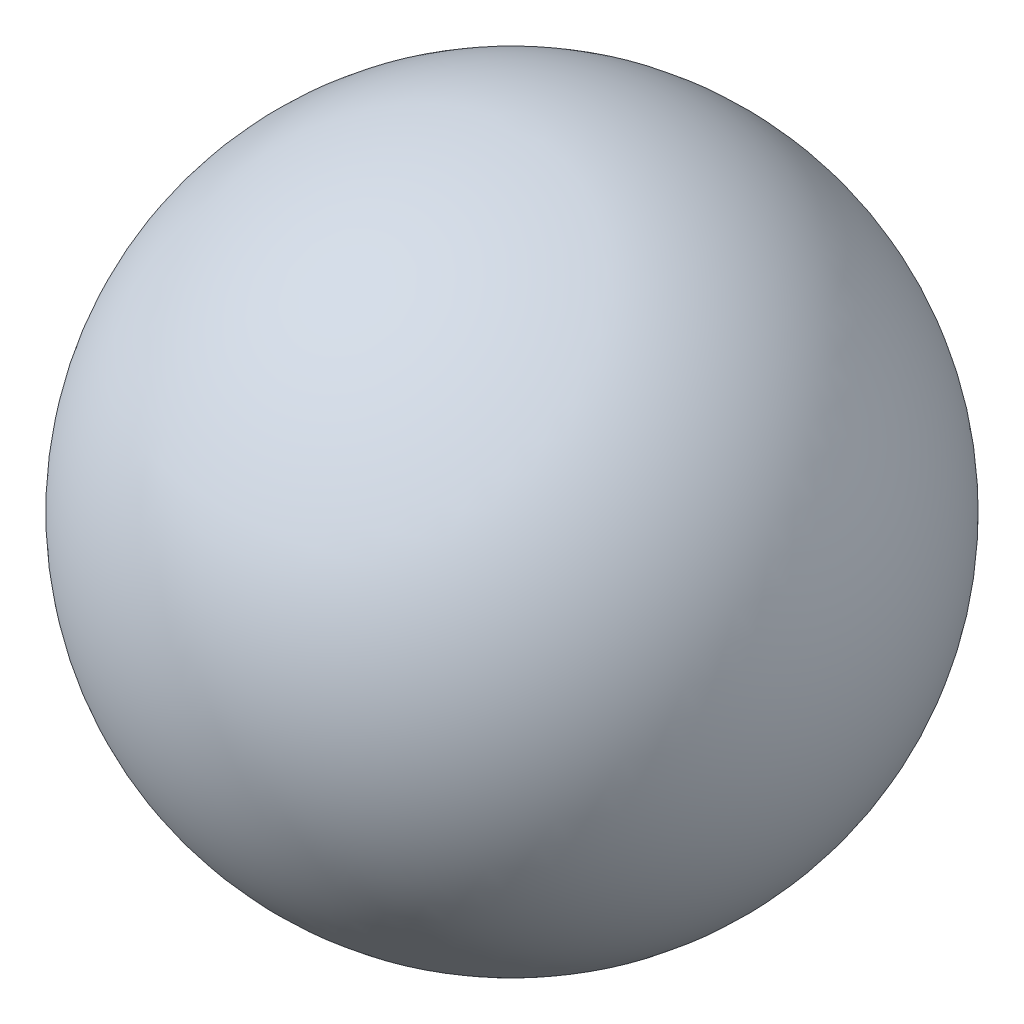
ISO-10303-21;
HEADER;
FILE_DESCRIPTION(('STEP AP214'),'2;1');
FILE_NAME('part.step','',(''),(''),'','','');
FILE_SCHEMA(('AUTOMOTIVE_DESIGN { 1 0 10303 214 1 1 1 1 }'));
ENDSEC;
DATA;
#1=APPLICATION_CONTEXT('core data for automotive mechanical design processes');
#2=APPLICATION_PROTOCOL_DEFINITION('international standard','automotive_design',2000,#1);
#3=PRODUCT_CONTEXT('',#1,'mechanical');
#4=PRODUCT('Part','Part','',(#3));
#5=PRODUCT_RELATED_PRODUCT_CATEGORY('part','',(#4));
#6=PRODUCT_DEFINITION_FORMATION('','',#4);
#7=PRODUCT_DEFINITION_CONTEXT('part definition',#1,'design');
#8=PRODUCT_DEFINITION('design','',#6,#7);
#9=PRODUCT_DEFINITION_SHAPE('','',#8);
#10=(LENGTH_UNIT() NAMED_UNIT(*) SI_UNIT(.MILLI.,.METRE.));
#11=(NAMED_UNIT(*) PLANE_ANGLE_UNIT() SI_UNIT($,.RADIAN.));
#12=(NAMED_UNIT(*) SI_UNIT($,.STERADIAN.) SOLID_ANGLE_UNIT());
#13=UNCERTAINTY_MEASURE_WITH_UNIT(LENGTH_MEASURE(1.E-05),#10,'distance_accuracy_value','');
#14=(GEOMETRIC_REPRESENTATION_CONTEXT(3) GLOBAL_UNCERTAINTY_ASSIGNED_CONTEXT((#13)) GLOBAL_UNIT_ASSIGNED_CONTEXT((#10,
#11,#12)) REPRESENTATION_CONTEXT('',''));
#15=CARTESIAN_POINT('',(0.,0.,0.));
#16=DIRECTION('',(0.,0.,1.));
#17=DIRECTION('',(1.,0.,0.));
#18=AXIS2_PLACEMENT_3D('',#15,#16,#17);
#19=CARTESIAN_POINT('',(0.,0.,0.));
#20=DIRECTION('',(0.,1.,0.));
#21=DIRECTION('',(0.,0.,1.));
#22=AXIS2_PLACEMENT_3D('',#19,#20,#21);
#23=SPHERICAL_SURFACE('',#22,6.35);
#24=CARTESIAN_POINT('',(0.,6.35,0.));
#25=VERTEX_POINT('',#24);
#26=VERTEX_LOOP('',#25);
#27=FACE_BOUND('',#26,.T.);
#28=ADVANCED_FACE('F39',(#27),#23,.T.);
#29=CLOSED_SHELL('',(#28));
#30=MANIFOLD_SOLID_BREP('B2',#29);
#31=ADVANCED_BREP_SHAPE_REPRESENTATION('',(#18,#30),#14);
#32=SHAPE_DEFINITION_REPRESENTATION(#9,#31);
ENDSEC;
END-ISO-10303-21;
